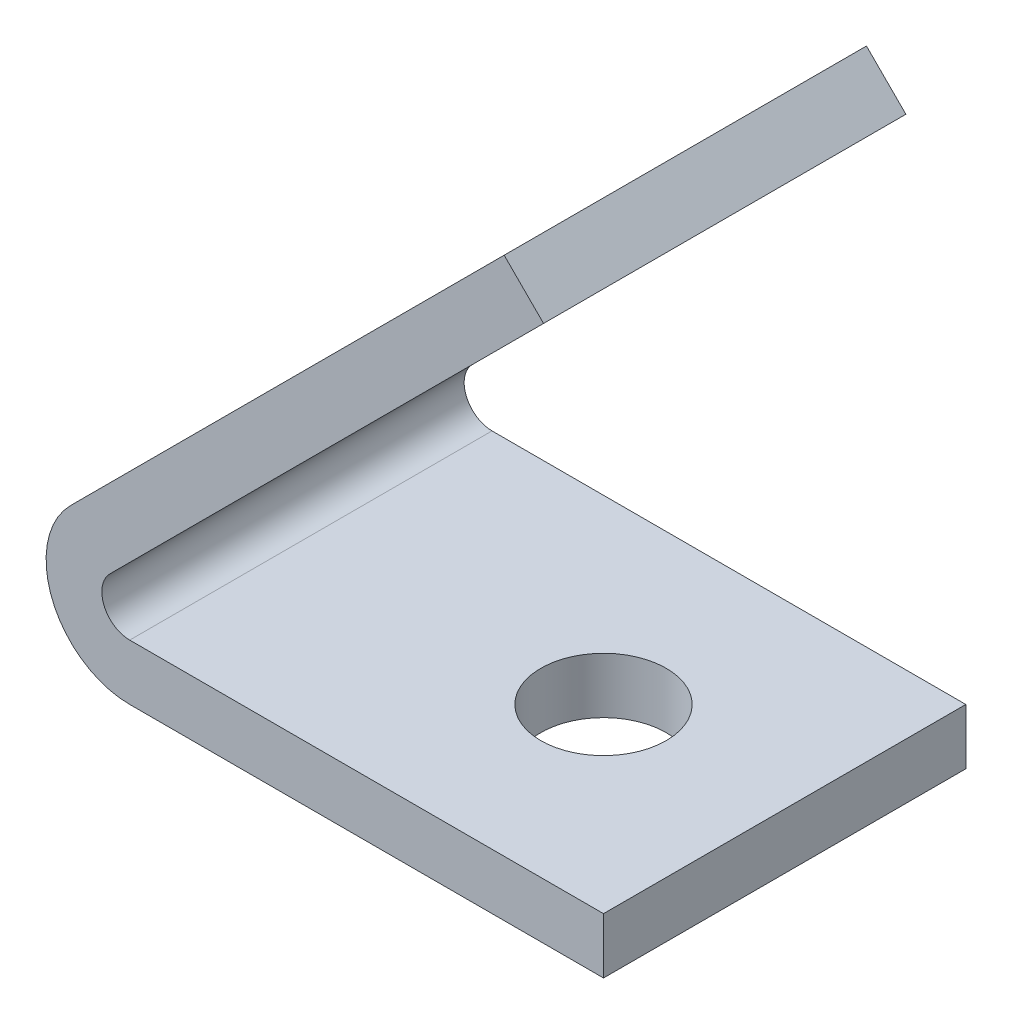
ISO-10303-21;
HEADER;
FILE_DESCRIPTION(('STEP AP214'),'2;1');
FILE_NAME('part.step','',(''),(''),'','','');
FILE_SCHEMA(('AUTOMOTIVE_DESIGN { 1 0 10303 214 1 1 1 1 }'));
ENDSEC;
DATA;
#1=APPLICATION_CONTEXT('core data for automotive mechanical design processes');
#2=APPLICATION_PROTOCOL_DEFINITION('international standard','automotive_design',2000,#1);
#3=PRODUCT_CONTEXT('',#1,'mechanical');
#4=PRODUCT('Part','Part','',(#3));
#5=PRODUCT_RELATED_PRODUCT_CATEGORY('part','',(#4));
#6=PRODUCT_DEFINITION_FORMATION('','',#4);
#7=PRODUCT_DEFINITION_CONTEXT('part definition',#1,'design');
#8=PRODUCT_DEFINITION('design','',#6,#7);
#9=PRODUCT_DEFINITION_SHAPE('','',#8);
#10=(LENGTH_UNIT() NAMED_UNIT(*) SI_UNIT(.MILLI.,.METRE.));
#11=(NAMED_UNIT(*) PLANE_ANGLE_UNIT() SI_UNIT($,.RADIAN.));
#12=(NAMED_UNIT(*) SI_UNIT($,.STERADIAN.) SOLID_ANGLE_UNIT());
#13=UNCERTAINTY_MEASURE_WITH_UNIT(LENGTH_MEASURE(1.E-05),#10,'distance_accuracy_value','');
#14=(GEOMETRIC_REPRESENTATION_CONTEXT(3) GLOBAL_UNCERTAINTY_ASSIGNED_CONTEXT((#13)) GLOBAL_UNIT_ASSIGNED_CONTEXT((#10,
#11,#12)) REPRESENTATION_CONTEXT('',''));
#15=CARTESIAN_POINT('',(0.,0.,0.));
#16=DIRECTION('',(0.,0.,1.));
#17=DIRECTION('',(1.,0.,0.));
#18=AXIS2_PLACEMENT_3D('',#15,#16,#17);
#19=CARTESIAN_POINT('',(7.27993596973273,11.7700640302673,20.6375));
#20=DIRECTION('',(-0.707106781186544,0.707106781186551,0.));
#21=DIRECTION('',(-0.707106781186551,-0.707106781186544,0.));
#22=AXIS2_PLACEMENT_3D('',#19,#20,#21);
#23=PLANE('',#22);
#24=CARTESIAN_POINT('',(42.0784284388759,46.5685564994101,0.));
#25=DIRECTION('',(-0.707106781186544,0.707106781186551,0.));
#26=DIRECTION('',(-0.707106781186551,-0.707106781186544,0.));
#27=AXIS2_PLACEMENT_3D('',#24,#25,#26);
#28=CIRCLE('',#27,7.14375000000001);
#29=CARTESIAN_POINT('',(37.0270343707744,41.5171624313087,0.));
#30=VERTEX_POINT('',#29);
#31=EDGE_CURVE('E185',#30,#30,#28,.T.);
#32=ORIENTED_EDGE('',*,*,#31,.T.);
#33=EDGE_LOOP('',(#32));
#34=FACE_BOUND('',#33,.T.);
#35=DIRECTION('',(0.707106781186551,0.707106781186544,0.));
#36=VECTOR('',#35,1.);
#37=CARTESIAN_POINT('',(7.27993596973273,11.7700640302673,-20.6375));
#38=LINE('',#37,#36);
#39=CARTESIAN_POINT('',(7.27993596973273,11.7700640302673,-20.6375));
#40=VERTEX_POINT('',#39);
#41=CARTESIAN_POINT('',(56.6713446356133,61.1614726961474,-20.6375));
#42=VERTEX_POINT('',#41);
#43=EDGE_CURVE('E134',#40,#42,#38,.T.);
#44=ORIENTED_EDGE('',*,*,#43,.T.);
#45=DIRECTION('',(0.,0.,-1.));
#46=VECTOR('',#45,1.);
#47=CARTESIAN_POINT('',(56.6713446356133,61.1614726961474,20.6375));
#48=LINE('',#47,#46);
#49=CARTESIAN_POINT('',(56.6713446356133,61.1614726961474,20.6375));
#50=VERTEX_POINT('',#49);
#51=EDGE_CURVE('E11',#50,#42,#48,.T.);
#52=ORIENTED_EDGE('',*,*,#51,.F.);
#53=DIRECTION('',(0.707106781186551,0.707106781186544,0.));
#54=VECTOR('',#53,1.);
#55=CARTESIAN_POINT('',(7.27993596973273,11.7700640302673,20.6375));
#56=LINE('',#55,#54);
#57=CARTESIAN_POINT('',(7.27993596973273,11.7700640302673,20.6375));
#58=VERTEX_POINT('',#57);
#59=EDGE_CURVE('E92',#58,#50,#56,.T.);
#60=ORIENTED_EDGE('',*,*,#59,.F.);
#61=DIRECTION('',(0.,0.,-1.));
#62=VECTOR('',#61,1.);
#63=CARTESIAN_POINT('',(7.27993596973273,11.7700640302673,20.6375));
#64=LINE('',#63,#62);
#65=EDGE_CURVE('E133',#58,#40,#64,.T.);
#66=ORIENTED_EDGE('',*,*,#65,.T.);
#67=EDGE_LOOP('',(#44,#52,#60,#66));
#68=FACE_BOUND('',#67,.T.);
#69=ADVANCED_FACE('F37',(#34,#68),#23,.F.);
#70=CARTESIAN_POINT('',(52.1812165750788,65.651600756682,20.6375));
#71=DIRECTION('',(0.70710678118655,0.707106781186545,0.));
#72=DIRECTION('',(-0.707106781186545,0.70710678118655,0.));
#73=AXIS2_PLACEMENT_3D('',#70,#71,#72);
#74=PLANE('',#73);
#75=DIRECTION('',(0.707106781186545,-0.70710678118655,0.));
#76=VECTOR('',#75,1.);
#77=CARTESIAN_POINT('',(52.1812165750788,65.651600756682,-20.6375));
#78=LINE('',#77,#76);
#79=CARTESIAN_POINT('',(52.1812165750788,65.651600756682,-20.6375));
#80=VERTEX_POINT('',#79);
#81=EDGE_CURVE('E137',#80,#42,#78,.T.);
#82=ORIENTED_EDGE('',*,*,#81,.F.);
#83=DIRECTION('',(0.,0.,-1.));
#84=VECTOR('',#83,1.);
#85=CARTESIAN_POINT('',(52.1812165750788,65.651600756682,20.6375));
#86=LINE('',#85,#84);
#87=CARTESIAN_POINT('',(52.1812165750788,65.651600756682,20.6375));
#88=VERTEX_POINT('',#87);
#89=EDGE_CURVE('E45',#88,#80,#86,.T.);
#90=ORIENTED_EDGE('',*,*,#89,.F.);
#91=DIRECTION('',(0.707106781186545,-0.70710678118655,0.));
#92=VECTOR('',#91,1.);
#93=CARTESIAN_POINT('',(52.1812165750788,65.651600756682,20.6375));
#94=LINE('',#93,#92);
#95=EDGE_CURVE('E177',#88,#50,#94,.T.);
#96=ORIENTED_EDGE('',*,*,#95,.T.);
#97=ORIENTED_EDGE('',*,*,#51,.T.);
#98=EDGE_LOOP('',(#82,#90,#96,#97));
#99=FACE_BOUND('',#98,.T.);
#100=ADVANCED_FACE('F168',(#99),#74,.T.);
#101=CARTESIAN_POINT('',(2.78980790919817,16.2601920908019,20.6375));
#102=DIRECTION('',(-0.707106781186544,0.707106781186551,0.));
#103=DIRECTION('',(-0.707106781186551,-0.707106781186544,0.));
#104=AXIS2_PLACEMENT_3D('',#101,#102,#103);
#105=PLANE('',#104);
#106=CARTESIAN_POINT('',(37.5883003783413,51.0586845599447,0.));
#107=DIRECTION('',(-0.707106781186544,0.707106781186551,0.));
#108=DIRECTION('',(-0.707106781186551,-0.707106781186544,0.));
#109=AXIS2_PLACEMENT_3D('',#106,#107,#108);
#110=CIRCLE('',#109,7.14375000000001);
#111=CARTESIAN_POINT('',(32.5369063102399,46.0072904918433,0.));
#112=VERTEX_POINT('',#111);
#113=EDGE_CURVE('E188',#112,#112,#110,.T.);
#114=ORIENTED_EDGE('',*,*,#113,.F.);
#115=EDGE_LOOP('',(#114));
#116=FACE_BOUND('',#115,.T.);
#117=DIRECTION('',(0.707106781186551,0.707106781186544,0.));
#118=VECTOR('',#117,1.);
#119=CARTESIAN_POINT('',(2.78980790919817,16.2601920908019,-20.6375));
#120=LINE('',#119,#118);
#121=CARTESIAN_POINT('',(2.78980790919817,16.2601920908019,-20.6375));
#122=VERTEX_POINT('',#121);
#123=EDGE_CURVE('E141',#122,#80,#120,.T.);
#124=ORIENTED_EDGE('',*,*,#123,.F.);
#125=DIRECTION('',(0.,0.,-1.));
#126=VECTOR('',#125,1.);
#127=CARTESIAN_POINT('',(2.78980790919817,16.2601920908019,20.6375));
#128=LINE('',#127,#126);
#129=CARTESIAN_POINT('',(2.78980790919817,16.2601920908019,20.6375));
#130=VERTEX_POINT('',#129);
#131=EDGE_CURVE('E158',#130,#122,#128,.T.);
#132=ORIENTED_EDGE('',*,*,#131,.F.);
#133=DIRECTION('',(0.707106781186551,0.707106781186544,0.));
#134=VECTOR('',#133,1.);
#135=CARTESIAN_POINT('',(2.78980790919817,16.2601920908019,20.6375));
#136=LINE('',#135,#134);
#137=EDGE_CURVE('E165',#130,#88,#136,.T.);
#138=ORIENTED_EDGE('',*,*,#137,.T.);
#139=ORIENTED_EDGE('',*,*,#89,.T.);
#140=EDGE_LOOP('',(#124,#132,#138,#139));
#141=FACE_BOUND('',#140,.T.);
#142=ADVANCED_FACE('F163',(#116,#141),#105,.T.);
#143=CARTESIAN_POINT('',(9.525,9.52499999999999,20.6375));
#144=DIRECTION('',(0.,0.,-1.));
#145=DIRECTION('',(-1.,0.,0.));
#146=AXIS2_PLACEMENT_3D('',#143,#144,#145);
#147=CYLINDRICAL_SURFACE('',#146,9.525);
#148=CARTESIAN_POINT('',(9.525,9.52499999999999,-20.6375));
#149=DIRECTION('',(0.,0.,-1.));
#150=DIRECTION('',(-1.,0.,0.));
#151=AXIS2_PLACEMENT_3D('',#148,#149,#150);
#152=CIRCLE('',#151,9.525);
#153=CARTESIAN_POINT('',(9.525,0.,-20.6375));
#154=VERTEX_POINT('',#153);
#155=EDGE_CURVE('E144',#154,#122,#152,.T.);
#156=ORIENTED_EDGE('',*,*,#155,.F.);
#157=DIRECTION('',(0.,0.,-1.));
#158=VECTOR('',#157,1.);
#159=CARTESIAN_POINT('',(9.525,0.,20.6375));
#160=LINE('',#159,#158);
#161=CARTESIAN_POINT('',(9.525,0.,20.6375));
#162=VERTEX_POINT('',#161);
#163=EDGE_CURVE('E156',#162,#154,#160,.T.);
#164=ORIENTED_EDGE('',*,*,#163,.F.);
#165=CARTESIAN_POINT('',(9.525,9.52499999999999,20.6375));
#166=DIRECTION('',(0.,0.,-1.));
#167=DIRECTION('',(-1.,0.,0.));
#168=AXIS2_PLACEMENT_3D('',#165,#166,#167);
#169=CIRCLE('',#168,9.525);
#170=EDGE_CURVE('E128',#162,#130,#169,.T.);
#171=ORIENTED_EDGE('',*,*,#170,.T.);
#172=ORIENTED_EDGE('',*,*,#131,.T.);
#173=EDGE_LOOP('',(#156,#164,#171,#172));
#174=FACE_BOUND('',#173,.T.);
#175=ADVANCED_FACE('F175',(#174),#147,.T.);
#176=CARTESIAN_POINT('',(63.5,0.,20.6375));
#177=DIRECTION('',(0.,-1.,0.));
#178=DIRECTION('',(1.,0.,0.));
#179=AXIS2_PLACEMENT_3D('',#176,#177,#178);
#180=PLANE('',#179);
#181=CARTESIAN_POINT('',(42.8625,0.,0.));
#182=DIRECTION('',(0.,-1.,0.));
#183=DIRECTION('',(1.,0.,0.));
#184=AXIS2_PLACEMENT_3D('',#181,#182,#183);
#185=CIRCLE('',#184,7.14375);
#186=CARTESIAN_POINT('',(50.00625,0.,0.));
#187=VERTEX_POINT('',#186);
#188=EDGE_CURVE('E182',#187,#187,#185,.T.);
#189=ORIENTED_EDGE('',*,*,#188,.F.);
#190=EDGE_LOOP('',(#189));
#191=FACE_BOUND('',#190,.T.);
#192=DIRECTION('',(-1.,0.,0.));
#193=VECTOR('',#192,1.);
#194=CARTESIAN_POINT('',(63.5,0.,-20.6375));
#195=LINE('',#194,#193);
#196=CARTESIAN_POINT('',(63.5,0.,-20.6375));
#197=VERTEX_POINT('',#196);
#198=EDGE_CURVE('E147',#197,#154,#195,.T.);
#199=ORIENTED_EDGE('',*,*,#198,.F.);
#200=DIRECTION('',(0.,0.,-1.));
#201=VECTOR('',#200,1.);
#202=CARTESIAN_POINT('',(63.5,0.,20.6375));
#203=LINE('',#202,#201);
#204=CARTESIAN_POINT('',(63.5,0.,20.6375));
#205=VERTEX_POINT('',#204);
#206=EDGE_CURVE('E116',#205,#197,#203,.T.);
#207=ORIENTED_EDGE('',*,*,#206,.F.);
#208=DIRECTION('',(-1.,0.,0.));
#209=VECTOR('',#208,1.);
#210=CARTESIAN_POINT('',(63.5,0.,20.6375));
#211=LINE('',#210,#209);
#212=EDGE_CURVE('E126',#205,#162,#211,.T.);
#213=ORIENTED_EDGE('',*,*,#212,.T.);
#214=ORIENTED_EDGE('',*,*,#163,.T.);
#215=EDGE_LOOP('',(#199,#207,#213,#214));
#216=FACE_BOUND('',#215,.T.);
#217=ADVANCED_FACE('F209',(#191,#216),#180,.T.);
#218=CARTESIAN_POINT('',(63.5,6.35,20.6375));
#219=DIRECTION('',(1.,0.,0.));
#220=DIRECTION('',(0.,0.,-1.));
#221=AXIS2_PLACEMENT_3D('',#218,#219,#220);
#222=PLANE('',#221);
#223=DIRECTION('',(0.,-1.,0.));
#224=VECTOR('',#223,1.);
#225=CARTESIAN_POINT('',(63.5,6.35,-20.6375));
#226=LINE('',#225,#224);
#227=CARTESIAN_POINT('',(63.5,6.35,-20.6375));
#228=VERTEX_POINT('',#227);
#229=EDGE_CURVE('E115',#228,#197,#226,.T.);
#230=ORIENTED_EDGE('',*,*,#229,.F.);
#231=DIRECTION('',(0.,0.,-1.));
#232=VECTOR('',#231,1.);
#233=CARTESIAN_POINT('',(63.5,6.35,20.6375));
#234=LINE('',#233,#232);
#235=CARTESIAN_POINT('',(63.5,6.35,20.6375));
#236=VERTEX_POINT('',#235);
#237=EDGE_CURVE('E109',#236,#228,#234,.T.);
#238=ORIENTED_EDGE('',*,*,#237,.F.);
#239=DIRECTION('',(0.,-1.,0.));
#240=VECTOR('',#239,1.);
#241=CARTESIAN_POINT('',(63.5,6.35,20.6375));
#242=LINE('',#241,#240);
#243=EDGE_CURVE('E113',#236,#205,#242,.T.);
#244=ORIENTED_EDGE('',*,*,#243,.T.);
#245=ORIENTED_EDGE('',*,*,#206,.T.);
#246=EDGE_LOOP('',(#230,#238,#244,#245));
#247=FACE_BOUND('',#246,.T.);
#248=ADVANCED_FACE('F111',(#247),#222,.T.);
#249=CARTESIAN_POINT('',(63.5,6.35,20.6375));
#250=DIRECTION('',(0.,-1.,0.));
#251=DIRECTION('',(1.,0.,0.));
#252=AXIS2_PLACEMENT_3D('',#249,#250,#251);
#253=PLANE('',#252);
#254=CARTESIAN_POINT('',(42.8625,6.35,0.));
#255=DIRECTION('',(0.,-1.,0.));
#256=DIRECTION('',(1.,0.,0.));
#257=AXIS2_PLACEMENT_3D('',#254,#255,#256);
#258=CIRCLE('',#257,7.14375);
#259=CARTESIAN_POINT('',(50.00625,6.35,0.));
#260=VERTEX_POINT('',#259);
#261=EDGE_CURVE('E138',#260,#260,#258,.T.);
#262=ORIENTED_EDGE('',*,*,#261,.T.);
#263=EDGE_LOOP('',(#262));
#264=FACE_BOUND('',#263,.T.);
#265=DIRECTION('',(-1.,0.,0.));
#266=VECTOR('',#265,1.);
#267=CARTESIAN_POINT('',(63.5,6.35,-20.6375));
#268=LINE('',#267,#266);
#269=CARTESIAN_POINT('',(9.525,6.35,-20.6375));
#270=VERTEX_POINT('',#269);
#271=EDGE_CURVE('E80',#228,#270,#268,.T.);
#272=ORIENTED_EDGE('',*,*,#271,.T.);
#273=DIRECTION('',(0.,0.,-1.));
#274=VECTOR('',#273,1.);
#275=CARTESIAN_POINT('',(9.525,6.35,20.6375));
#276=LINE('',#275,#274);
#277=CARTESIAN_POINT('',(9.525,6.35,20.6375));
#278=VERTEX_POINT('',#277);
#279=EDGE_CURVE('E117',#278,#270,#276,.T.);
#280=ORIENTED_EDGE('',*,*,#279,.F.);
#281=DIRECTION('',(-1.,0.,0.));
#282=VECTOR('',#281,1.);
#283=CARTESIAN_POINT('',(63.5,6.35,20.6375));
#284=LINE('',#283,#282);
#285=EDGE_CURVE('E119',#236,#278,#284,.T.);
#286=ORIENTED_EDGE('',*,*,#285,.F.);
#287=ORIENTED_EDGE('',*,*,#237,.T.);
#288=EDGE_LOOP('',(#272,#280,#286,#287));
#289=FACE_BOUND('',#288,.T.);
#290=ADVANCED_FACE('F120',(#264,#289),#253,.F.);
#291=CARTESIAN_POINT('',(9.525,9.52499999999999,20.6375));
#292=DIRECTION('',(0.,0.,-1.));
#293=DIRECTION('',(-1.,0.,0.));
#294=AXIS2_PLACEMENT_3D('',#291,#292,#293);
#295=CYLINDRICAL_SURFACE('',#294,3.175);
#296=CARTESIAN_POINT('',(9.525,9.52499999999999,-20.6375));
#297=DIRECTION('',(0.,0.,1.));
#298=DIRECTION('',(1.,0.,0.));
#299=AXIS2_PLACEMENT_3D('',#296,#297,#298);
#300=CIRCLE('',#299,3.175);
#301=EDGE_CURVE('E86',#270,#40,#300,.F.);
#302=ORIENTED_EDGE('',*,*,#301,.T.);
#303=ORIENTED_EDGE('',*,*,#65,.F.);
#304=CARTESIAN_POINT('',(9.525,9.52499999999999,20.6375));
#305=DIRECTION('',(0.,0.,1.));
#306=DIRECTION('',(1.,0.,0.));
#307=AXIS2_PLACEMENT_3D('',#304,#305,#306);
#308=CIRCLE('',#307,3.175);
#309=EDGE_CURVE('E53',#278,#58,#308,.F.);
#310=ORIENTED_EDGE('',*,*,#309,.F.);
#311=ORIENTED_EDGE('',*,*,#279,.T.);
#312=EDGE_LOOP('',(#302,#303,#310,#311));
#313=FACE_BOUND('',#312,.T.);
#314=ADVANCED_FACE('F243',(#313),#295,.F.);
#315=CARTESIAN_POINT('',(9.525,9.52499999999999,20.6375));
#316=DIRECTION('',(0.,0.,-1.));
#317=DIRECTION('',(-1.,0.,0.));
#318=AXIS2_PLACEMENT_3D('',#315,#316,#317);
#319=PLANE('',#318);
#320=ORIENTED_EDGE('',*,*,#59,.T.);
#321=ORIENTED_EDGE('',*,*,#95,.F.);
#322=ORIENTED_EDGE('',*,*,#137,.F.);
#323=ORIENTED_EDGE('',*,*,#170,.F.);
#324=ORIENTED_EDGE('',*,*,#212,.F.);
#325=ORIENTED_EDGE('',*,*,#243,.F.);
#326=ORIENTED_EDGE('',*,*,#285,.T.);
#327=ORIENTED_EDGE('',*,*,#309,.T.);
#328=EDGE_LOOP('',(#320,#321,#322,#323,#324,#325,#326,#327));
#329=FACE_BOUND('',#328,.T.);
#330=ADVANCED_FACE('F123',(#329),#319,.F.);
#331=CARTESIAN_POINT('',(9.525,9.52499999999999,-20.6375));
#332=DIRECTION('',(0.,0.,-1.));
#333=DIRECTION('',(-1.,0.,0.));
#334=AXIS2_PLACEMENT_3D('',#331,#332,#333);
#335=PLANE('',#334);
#336=ORIENTED_EDGE('',*,*,#43,.F.);
#337=ORIENTED_EDGE('',*,*,#301,.F.);
#338=ORIENTED_EDGE('',*,*,#271,.F.);
#339=ORIENTED_EDGE('',*,*,#229,.T.);
#340=ORIENTED_EDGE('',*,*,#198,.T.);
#341=ORIENTED_EDGE('',*,*,#155,.T.);
#342=ORIENTED_EDGE('',*,*,#123,.T.);
#343=ORIENTED_EDGE('',*,*,#81,.T.);
#344=EDGE_LOOP('',(#336,#337,#338,#339,#340,#341,#342,#343));
#345=FACE_BOUND('',#344,.T.);
#346=ADVANCED_FACE('F171',(#345),#335,.T.);
#347=CARTESIAN_POINT('',(42.8625,6.35,0.));
#348=DIRECTION('',(0.,-1.,0.));
#349=DIRECTION('',(1.,0.,0.));
#350=AXIS2_PLACEMENT_3D('',#347,#348,#349);
#351=CYLINDRICAL_SURFACE('',#350,7.14375);
#352=ORIENTED_EDGE('',*,*,#261,.F.);
#353=EDGE_LOOP('',(#352));
#354=FACE_BOUND('',#353,.T.);
#355=ORIENTED_EDGE('',*,*,#188,.T.);
#356=EDGE_LOOP('',(#355));
#357=FACE_BOUND('',#356,.T.);
#358=ADVANCED_FACE('F199',(#354,#357),#351,.F.);
#359=CARTESIAN_POINT('',(42.0784284388759,46.5685564994101,0.));
#360=DIRECTION('',(-0.707106781186544,0.707106781186551,0.));
#361=DIRECTION('',(-0.707106781186551,-0.707106781186544,0.));
#362=AXIS2_PLACEMENT_3D('',#359,#360,#361);
#363=CYLINDRICAL_SURFACE('',#362,7.14375000000001);
#364=ORIENTED_EDGE('',*,*,#31,.F.);
#365=EDGE_LOOP('',(#364));
#366=FACE_BOUND('',#365,.T.);
#367=ORIENTED_EDGE('',*,*,#113,.T.);
#368=EDGE_LOOP('',(#367));
#369=FACE_BOUND('',#368,.T.);
#370=ADVANCED_FACE('F196',(#366,#369),#363,.F.);
#371=CLOSED_SHELL('',(#69,#100,#142,#175,#217,#248,#290,#314,#330,#346,#358,#370));
#372=MANIFOLD_SOLID_BREP('B2',#371);
#373=ADVANCED_BREP_SHAPE_REPRESENTATION('',(#18,#372),#14);
#374=SHAPE_DEFINITION_REPRESENTATION(#9,#373);
ENDSEC;
END-ISO-10303-21;
